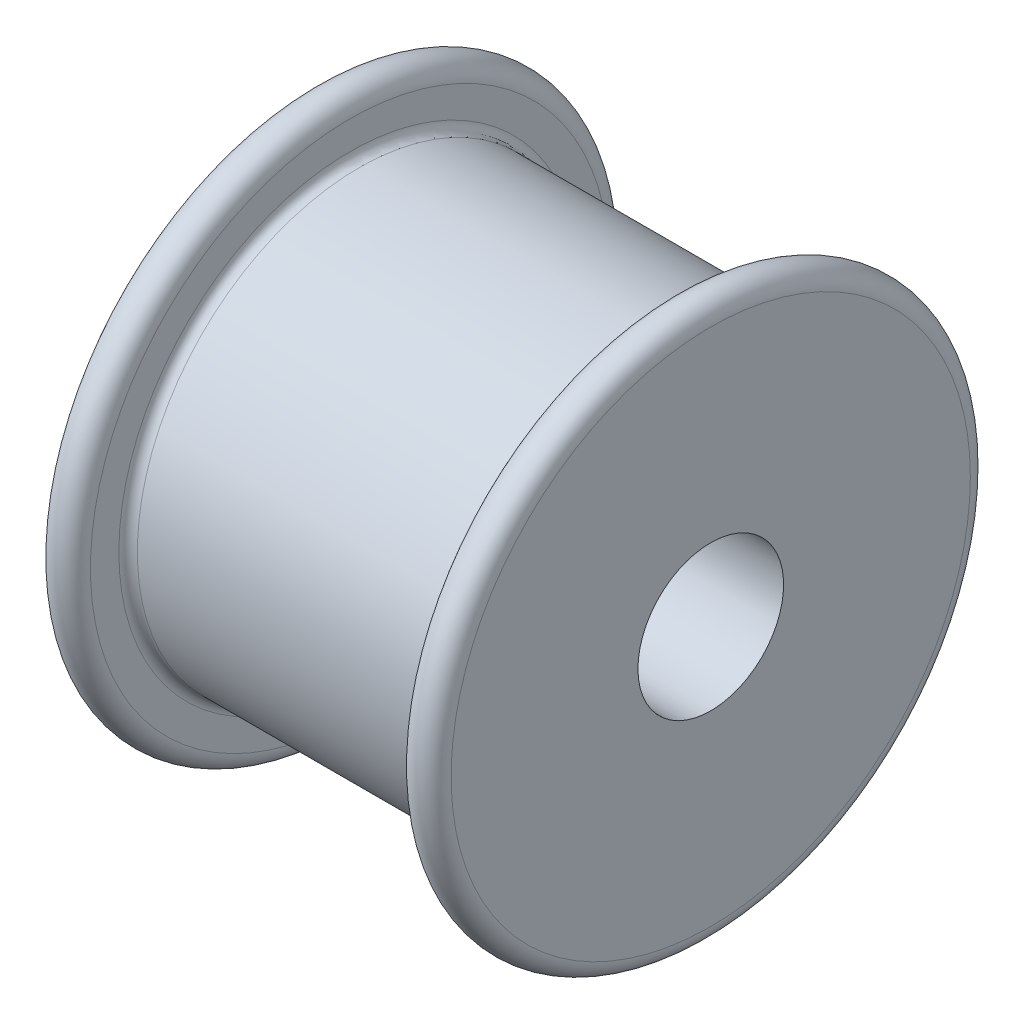
ISO-10303-21;
HEADER;
FILE_DESCRIPTION(('STEP AP214'),'2;1');
FILE_NAME('part.step','',(''),(''),'','','');
FILE_SCHEMA(('AUTOMOTIVE_DESIGN { 1 0 10303 214 1 1 1 1 }'));
ENDSEC;
DATA;
#1=APPLICATION_CONTEXT('core data for automotive mechanical design processes');
#2=APPLICATION_PROTOCOL_DEFINITION('international standard','automotive_design',2000,#1);
#3=PRODUCT_CONTEXT('',#1,'mechanical');
#4=PRODUCT('Part','Part','',(#3));
#5=PRODUCT_RELATED_PRODUCT_CATEGORY('part','',(#4));
#6=PRODUCT_DEFINITION_FORMATION('','',#4);
#7=PRODUCT_DEFINITION_CONTEXT('part definition',#1,'design');
#8=PRODUCT_DEFINITION('design','',#6,#7);
#9=PRODUCT_DEFINITION_SHAPE('','',#8);
#10=(LENGTH_UNIT() NAMED_UNIT(*) SI_UNIT(.MILLI.,.METRE.));
#11=(NAMED_UNIT(*) PLANE_ANGLE_UNIT() SI_UNIT($,.RADIAN.));
#12=(NAMED_UNIT(*) SI_UNIT($,.STERADIAN.) SOLID_ANGLE_UNIT());
#13=UNCERTAINTY_MEASURE_WITH_UNIT(LENGTH_MEASURE(1.E-05),#10,'distance_accuracy_value','');
#14=(GEOMETRIC_REPRESENTATION_CONTEXT(3) GLOBAL_UNCERTAINTY_ASSIGNED_CONTEXT((#13)) GLOBAL_UNIT_ASSIGNED_CONTEXT((#10,
#11,#12)) REPRESENTATION_CONTEXT('',''));
#15=CARTESIAN_POINT('',(0.,0.,0.));
#16=DIRECTION('',(0.,0.,1.));
#17=DIRECTION('',(1.,0.,0.));
#18=AXIS2_PLACEMENT_3D('',#15,#16,#17);
#19=CARTESIAN_POINT('',(78.475,0.,0.));
#20=DIRECTION('',(-1.,0.,0.));
#21=DIRECTION('',(0.,0.,1.));
#22=AXIS2_PLACEMENT_3D('',#19,#20,#21);
#23=PLANE('',#22);
#24=CARTESIAN_POINT('',(78.475,0.,0.));
#25=DIRECTION('',(-1.,0.,0.));
#26=DIRECTION('',(0.,0.,1.));
#27=AXIS2_PLACEMENT_3D('',#24,#25,#26);
#28=CIRCLE('',#27,140.);
#29=CARTESIAN_POINT('',(78.475,0.,140.));
#30=VERTEX_POINT('',#29);
#31=EDGE_CURVE('E73',#30,#30,#28,.T.);
#32=ORIENTED_EDGE('',*,*,#31,.T.);
#33=EDGE_LOOP('',(#32));
#34=FACE_BOUND('',#33,.T.);
#35=CARTESIAN_POINT('',(78.475,0.,0.));
#36=DIRECTION('',(-1.,0.,0.));
#37=DIRECTION('',(0.,0.,1.));
#38=AXIS2_PLACEMENT_3D('',#35,#36,#37);
#39=CIRCLE('',#38,64.5597301838153);
#40=CARTESIAN_POINT('',(78.475,0.,64.5597301838153));
#41=VERTEX_POINT('',#40);
#42=EDGE_CURVE('E80',#41,#41,#39,.T.);
#43=ORIENTED_EDGE('',*,*,#42,.F.);
#44=EDGE_LOOP('',(#43));
#45=FACE_BOUND('',#44,.T.);
#46=ADVANCED_FACE('F38',(#34,#45),#23,.T.);
#47=CARTESIAN_POINT('',(136.525,0.,0.));
#48=DIRECTION('',(-1.,0.,0.));
#49=DIRECTION('',(0.,0.,1.));
#50=AXIS2_PLACEMENT_3D('',#47,#48,#49);
#51=CYLINDRICAL_SURFACE('',#50,50.);
#52=CARTESIAN_POINT('',(136.525,0.,0.));
#53=DIRECTION('',(-1.,0.,0.));
#54=DIRECTION('',(0.,0.,1.));
#55=AXIS2_PLACEMENT_3D('',#52,#53,#54);
#56=CIRCLE('',#55,50.);
#57=CARTESIAN_POINT('',(136.525,0.,50.));
#58=VERTEX_POINT('',#57);
#59=EDGE_CURVE('E70',#58,#58,#56,.T.);
#60=ORIENTED_EDGE('',*,*,#59,.F.);
#61=EDGE_LOOP('',(#60));
#62=FACE_BOUND('',#61,.T.);
#63=CARTESIAN_POINT('',(-36.525,0.,0.));
#64=DIRECTION('',(-1.,0.,0.));
#65=DIRECTION('',(0.,0.,1.));
#66=AXIS2_PLACEMENT_3D('',#63,#64,#65);
#67=CIRCLE('',#66,50.);
#68=CARTESIAN_POINT('',(-36.525,0.,50.));
#69=VERTEX_POINT('',#68);
#70=EDGE_CURVE('E83',#69,#69,#67,.T.);
#71=ORIENTED_EDGE('',*,*,#70,.T.);
#72=EDGE_LOOP('',(#71));
#73=FACE_BOUND('',#72,.T.);
#74=ADVANCED_FACE('F89',(#62,#73),#51,.F.);
#75=CARTESIAN_POINT('',(-104.775,0.,0.));
#76=DIRECTION('',(1.,0.,0.));
#77=DIRECTION('',(0.,0.,-1.));
#78=AXIS2_PLACEMENT_3D('',#75,#76,#77);
#79=TOROIDAL_SURFACE('',#78,158.75,6.34999999999999);
#80=CARTESIAN_POINT('',(-111.125,0.,0.));
#81=DIRECTION('',(1.,0.,0.));
#82=DIRECTION('',(0.,0.,-1.));
#83=AXIS2_PLACEMENT_3D('',#80,#81,#82);
#84=CIRCLE('',#83,158.75);
#85=CARTESIAN_POINT('',(-111.125,0.,-158.75));
#86=VERTEX_POINT('',#85);
#87=EDGE_CURVE('E10',#86,#86,#84,.T.);
#88=ORIENTED_EDGE('',*,*,#87,.T.);
#89=EDGE_LOOP('',(#88));
#90=FACE_BOUND('',#89,.T.);
#91=CARTESIAN_POINT('',(-104.775,0.,0.));
#92=DIRECTION('',(1.,0.,0.));
#93=DIRECTION('',(0.,0.,-1.));
#94=AXIS2_PLACEMENT_3D('',#91,#92,#93);
#95=CIRCLE('',#94,152.4);
#96=CARTESIAN_POINT('',(-104.775,0.,-152.4));
#97=VERTEX_POINT('',#96);
#98=EDGE_CURVE('E67',#97,#97,#95,.T.);
#99=ORIENTED_EDGE('',*,*,#98,.F.);
#100=EDGE_LOOP('',(#99));
#101=FACE_BOUND('',#100,.T.);
#102=ADVANCED_FACE('F40',(#90,#101),#79,.F.);
#103=CARTESIAN_POINT('',(-111.125,158.75,0.));
#104=DIRECTION('',(1.,0.,0.));
#105=DIRECTION('',(0.,0.,-1.));
#106=AXIS2_PLACEMENT_3D('',#103,#104,#105);
#107=PLANE('',#106);
#108=CARTESIAN_POINT('',(-111.125,0.,0.));
#109=DIRECTION('',(1.,0.,0.));
#110=DIRECTION('',(0.,0.,-1.));
#111=AXIS2_PLACEMENT_3D('',#108,#109,#110);
#112=CIRCLE('',#111,178.25);
#113=CARTESIAN_POINT('',(-111.125,0.,-178.25));
#114=VERTEX_POINT('',#113);
#115=EDGE_CURVE('E45',#114,#114,#112,.T.);
#116=ORIENTED_EDGE('',*,*,#115,.T.);
#117=EDGE_LOOP('',(#116));
#118=FACE_BOUND('',#117,.T.);
#119=ORIENTED_EDGE('',*,*,#87,.F.);
#120=EDGE_LOOP('',(#119));
#121=FACE_BOUND('',#120,.T.);
#122=ADVANCED_FACE('F141',(#118,#121),#107,.T.);
#123=CARTESIAN_POINT('',(-123.825,0.,0.));
#124=DIRECTION('',(1.,0.,0.));
#125=DIRECTION('',(0.,0.,-1.));
#126=AXIS2_PLACEMENT_3D('',#123,#124,#125);
#127=TOROIDAL_SURFACE('',#126,178.25,12.7);
#128=CARTESIAN_POINT('',(-136.525,0.,0.));
#129=DIRECTION('',(1.,0.,0.));
#130=DIRECTION('',(0.,0.,-1.));
#131=AXIS2_PLACEMENT_3D('',#128,#129,#130);
#132=CIRCLE('',#131,178.25);
#133=CARTESIAN_POINT('',(-136.525,0.,-178.25));
#134=VERTEX_POINT('',#133);
#135=EDGE_CURVE('E49',#134,#134,#132,.T.);
#136=ORIENTED_EDGE('',*,*,#135,.T.);
#137=EDGE_LOOP('',(#136));
#138=FACE_BOUND('',#137,.T.);
#139=ORIENTED_EDGE('',*,*,#115,.F.);
#140=EDGE_LOOP('',(#139));
#141=FACE_BOUND('',#140,.T.);
#142=ADVANCED_FACE('F138',(#138,#141),#127,.T.);
#143=CARTESIAN_POINT('',(-136.525,178.25,0.));
#144=DIRECTION('',(-1.,0.,0.));
#145=DIRECTION('',(0.,0.,1.));
#146=AXIS2_PLACEMENT_3D('',#143,#144,#145);
#147=PLANE('',#146);
#148=CARTESIAN_POINT('',(-136.525,0.,0.));
#149=DIRECTION('',(-1.,0.,0.));
#150=DIRECTION('',(0.,0.,1.));
#151=AXIS2_PLACEMENT_3D('',#148,#149,#150);
#152=CIRCLE('',#151,140.);
#153=CARTESIAN_POINT('',(-136.525,0.,140.));
#154=VERTEX_POINT('',#153);
#155=EDGE_CURVE('E74',#154,#154,#152,.T.);
#156=ORIENTED_EDGE('',*,*,#155,.F.);
#157=EDGE_LOOP('',(#156));
#158=FACE_BOUND('',#157,.T.);
#159=ORIENTED_EDGE('',*,*,#135,.F.);
#160=EDGE_LOOP('',(#159));
#161=FACE_BOUND('',#160,.T.);
#162=ADVANCED_FACE('F134',(#158,#161),#147,.T.);
#163=CARTESIAN_POINT('',(136.525,178.25,0.));
#164=DIRECTION('',(1.,0.,0.));
#165=DIRECTION('',(0.,0.,-1.));
#166=AXIS2_PLACEMENT_3D('',#163,#164,#165);
#167=PLANE('',#166);
#168=ORIENTED_EDGE('',*,*,#59,.T.);
#169=EDGE_LOOP('',(#168));
#170=FACE_BOUND('',#169,.T.);
#171=CARTESIAN_POINT('',(136.525,0.,0.));
#172=DIRECTION('',(1.,0.,0.));
#173=DIRECTION('',(0.,0.,-1.));
#174=AXIS2_PLACEMENT_3D('',#171,#172,#173);
#175=CIRCLE('',#174,178.25);
#176=CARTESIAN_POINT('',(136.525,0.,-178.25));
#177=VERTEX_POINT('',#176);
#178=EDGE_CURVE('E53',#177,#177,#175,.T.);
#179=ORIENTED_EDGE('',*,*,#178,.T.);
#180=EDGE_LOOP('',(#179));
#181=FACE_BOUND('',#180,.T.);
#182=ADVANCED_FACE('F130',(#170,#181),#167,.T.);
#183=CARTESIAN_POINT('',(123.825,0.,0.));
#184=DIRECTION('',(1.,0.,0.));
#185=DIRECTION('',(0.,0.,-1.));
#186=AXIS2_PLACEMENT_3D('',#183,#184,#185);
#187=TOROIDAL_SURFACE('',#186,178.25,12.7);
#188=CARTESIAN_POINT('',(111.125,0.,0.));
#189=DIRECTION('',(1.,0.,0.));
#190=DIRECTION('',(0.,0.,-1.));
#191=AXIS2_PLACEMENT_3D('',#188,#189,#190);
#192=CIRCLE('',#191,178.25);
#193=CARTESIAN_POINT('',(111.125,0.,-178.25));
#194=VERTEX_POINT('',#193);
#195=EDGE_CURVE('E58',#194,#194,#192,.T.);
#196=ORIENTED_EDGE('',*,*,#195,.T.);
#197=EDGE_LOOP('',(#196));
#198=FACE_BOUND('',#197,.T.);
#199=ORIENTED_EDGE('',*,*,#178,.F.);
#200=EDGE_LOOP('',(#199));
#201=FACE_BOUND('',#200,.T.);
#202=ADVANCED_FACE('F126',(#198,#201),#187,.T.);
#203=CARTESIAN_POINT('',(111.125,158.75,0.));
#204=DIRECTION('',(-1.,0.,0.));
#205=DIRECTION('',(0.,0.,1.));
#206=AXIS2_PLACEMENT_3D('',#203,#204,#205);
#207=PLANE('',#206);
#208=CARTESIAN_POINT('',(111.125,0.,0.));
#209=DIRECTION('',(1.,0.,0.));
#210=DIRECTION('',(0.,0.,-1.));
#211=AXIS2_PLACEMENT_3D('',#208,#209,#210);
#212=CIRCLE('',#211,158.75);
#213=CARTESIAN_POINT('',(111.125,0.,-158.75));
#214=VERTEX_POINT('',#213);
#215=EDGE_CURVE('E61',#214,#214,#212,.T.);
#216=ORIENTED_EDGE('',*,*,#215,.T.);
#217=EDGE_LOOP('',(#216));
#218=FACE_BOUND('',#217,.T.);
#219=ORIENTED_EDGE('',*,*,#195,.F.);
#220=EDGE_LOOP('',(#219));
#221=FACE_BOUND('',#220,.T.);
#222=ADVANCED_FACE('F122',(#218,#221),#207,.T.);
#223=CARTESIAN_POINT('',(104.775,0.,0.));
#224=DIRECTION('',(1.,0.,0.));
#225=DIRECTION('',(0.,0.,-1.));
#226=AXIS2_PLACEMENT_3D('',#223,#224,#225);
#227=TOROIDAL_SURFACE('',#226,158.75,6.34999999999999);
#228=CARTESIAN_POINT('',(104.775,0.,0.));
#229=DIRECTION('',(1.,0.,0.));
#230=DIRECTION('',(0.,0.,-1.));
#231=AXIS2_PLACEMENT_3D('',#228,#229,#230);
#232=CIRCLE('',#231,152.4);
#233=CARTESIAN_POINT('',(104.775,0.,-152.4));
#234=VERTEX_POINT('',#233);
#235=EDGE_CURVE('E64',#234,#234,#232,.T.);
#236=ORIENTED_EDGE('',*,*,#235,.T.);
#237=EDGE_LOOP('',(#236));
#238=FACE_BOUND('',#237,.T.);
#239=ORIENTED_EDGE('',*,*,#215,.F.);
#240=EDGE_LOOP('',(#239));
#241=FACE_BOUND('',#240,.T.);
#242=ADVANCED_FACE('F118',(#238,#241),#227,.F.);
#243=CARTESIAN_POINT('',(0.,0.,0.));
#244=DIRECTION('',(1.,0.,0.));
#245=DIRECTION('',(0.,0.,-1.));
#246=AXIS2_PLACEMENT_3D('',#243,#244,#245);
#247=CYLINDRICAL_SURFACE('',#246,152.4);
#248=ORIENTED_EDGE('',*,*,#98,.T.);
#249=EDGE_LOOP('',(#248));
#250=FACE_BOUND('',#249,.T.);
#251=ORIENTED_EDGE('',*,*,#235,.F.);
#252=EDGE_LOOP('',(#251));
#253=FACE_BOUND('',#252,.T.);
#254=ADVANCED_FACE('F103',(#250,#253),#247,.T.);
#255=CARTESIAN_POINT('',(78.475,0.,0.));
#256=DIRECTION('',(-1.,0.,0.));
#257=DIRECTION('',(0.,0.,1.));
#258=AXIS2_PLACEMENT_3D('',#255,#256,#257);
#259=CYLINDRICAL_SURFACE('',#258,140.);
#260=ORIENTED_EDGE('',*,*,#31,.F.);
#261=EDGE_LOOP('',(#260));
#262=FACE_BOUND('',#261,.T.);
#263=ORIENTED_EDGE('',*,*,#155,.T.);
#264=EDGE_LOOP('',(#263));
#265=FACE_BOUND('',#264,.T.);
#266=ADVANCED_FACE('F94',(#262,#265),#259,.F.);
#267=CARTESIAN_POINT('',(-36.525,0.,0.));
#268=DIRECTION('',(-1.,0.,0.));
#269=DIRECTION('',(0.,0.,1.));
#270=AXIS2_PLACEMENT_3D('',#267,#268,#269);
#271=PLANE('',#270);
#272=CARTESIAN_POINT('',(-36.525,0.,0.));
#273=DIRECTION('',(-1.,0.,0.));
#274=DIRECTION('',(0.,0.,1.));
#275=AXIS2_PLACEMENT_3D('',#272,#273,#274);
#276=CIRCLE('',#275,64.5597301838153);
#277=CARTESIAN_POINT('',(-36.525,0.,64.5597301838153));
#278=VERTEX_POINT('',#277);
#279=EDGE_CURVE('E77',#278,#278,#276,.T.);
#280=ORIENTED_EDGE('',*,*,#279,.T.);
#281=EDGE_LOOP('',(#280));
#282=FACE_BOUND('',#281,.T.);
#283=ORIENTED_EDGE('',*,*,#70,.F.);
#284=EDGE_LOOP('',(#283));
#285=FACE_BOUND('',#284,.T.);
#286=ADVANCED_FACE('F91',(#282,#285),#271,.T.);
#287=CARTESIAN_POINT('',(-36.525,0.,0.));
#288=DIRECTION('',(1.,0.,0.));
#289=DIRECTION('',(0.,0.,-1.));
#290=AXIS2_PLACEMENT_3D('',#287,#288,#289);
#291=CYLINDRICAL_SURFACE('',#290,64.5597301838153);
#292=ORIENTED_EDGE('',*,*,#279,.F.);
#293=EDGE_LOOP('',(#292));
#294=FACE_BOUND('',#293,.T.);
#295=ORIENTED_EDGE('',*,*,#42,.T.);
#296=EDGE_LOOP('',(#295));
#297=FACE_BOUND('',#296,.T.);
#298=ADVANCED_FACE('F93',(#294,#297),#291,.T.);
#299=CLOSED_SHELL('',(#46,#74,#102,#122,#142,#162,#182,#202,#222,#242,#254,#266,#286,#298));
#300=MANIFOLD_SOLID_BREP('B2',#299);
#301=ADVANCED_BREP_SHAPE_REPRESENTATION('',(#18,#300),#14);
#302=SHAPE_DEFINITION_REPRESENTATION(#9,#301);
ENDSEC;
END-ISO-10303-21;
